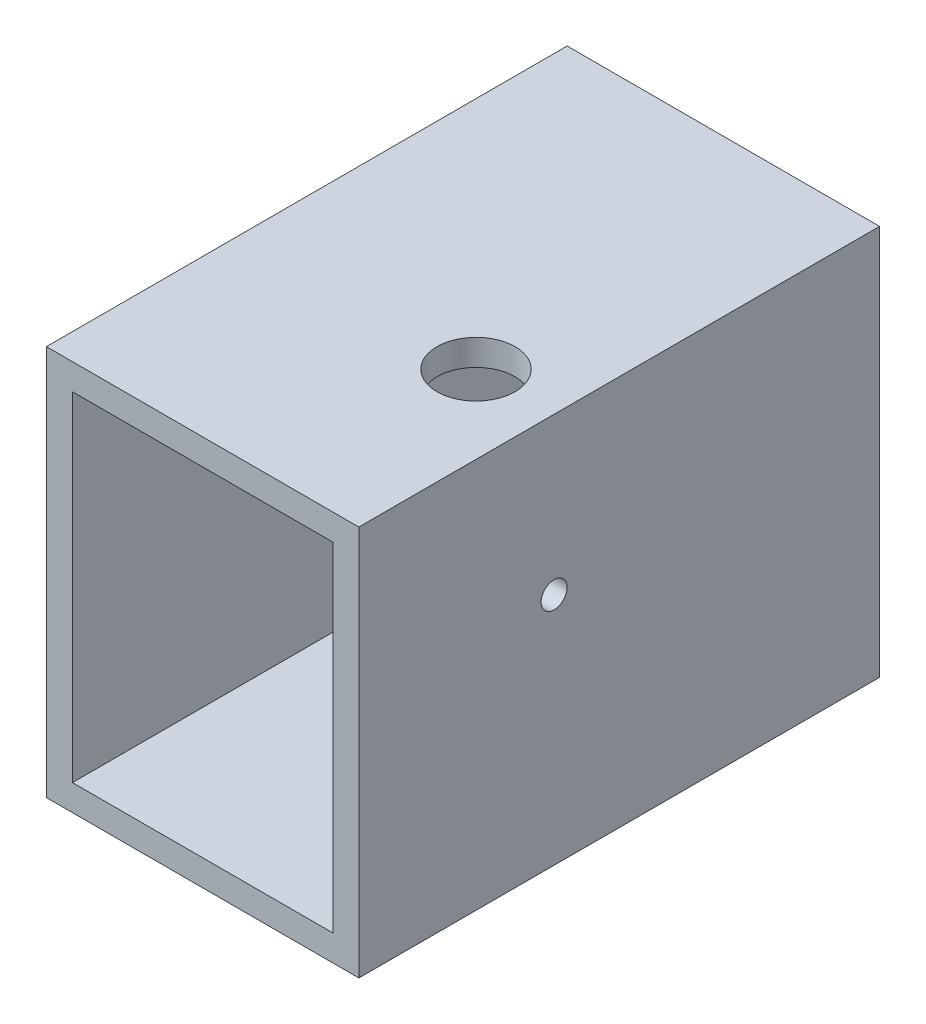
ISO-10303-21;
HEADER;
FILE_DESCRIPTION(('STEP AP214'),'2;1');
FILE_NAME('part.step','',(''),(''),'','','');
FILE_SCHEMA(('AUTOMOTIVE_DESIGN { 1 0 10303 214 1 1 1 1 }'));
ENDSEC;
DATA;
#1=APPLICATION_CONTEXT('core data for automotive mechanical design processes');
#2=APPLICATION_PROTOCOL_DEFINITION('international standard','automotive_design',2000,#1);
#3=PRODUCT_CONTEXT('',#1,'mechanical');
#4=PRODUCT('Part','Part','',(#3));
#5=PRODUCT_RELATED_PRODUCT_CATEGORY('part','',(#4));
#6=PRODUCT_DEFINITION_FORMATION('','',#4);
#7=PRODUCT_DEFINITION_CONTEXT('part definition',#1,'design');
#8=PRODUCT_DEFINITION('design','',#6,#7);
#9=PRODUCT_DEFINITION_SHAPE('','',#8);
#10=(LENGTH_UNIT() NAMED_UNIT(*) SI_UNIT(.MILLI.,.METRE.));
#11=(NAMED_UNIT(*) PLANE_ANGLE_UNIT() SI_UNIT($,.RADIAN.));
#12=(NAMED_UNIT(*) SI_UNIT($,.STERADIAN.) SOLID_ANGLE_UNIT());
#13=UNCERTAINTY_MEASURE_WITH_UNIT(LENGTH_MEASURE(1.E-05),#10,'distance_accuracy_value','');
#14=(GEOMETRIC_REPRESENTATION_CONTEXT(3) GLOBAL_UNCERTAINTY_ASSIGNED_CONTEXT((#13)) GLOBAL_UNIT_ASSIGNED_CONTEXT((#10,
#11,#12)) REPRESENTATION_CONTEXT('',''));
#15=CARTESIAN_POINT('',(0.,0.,0.));
#16=DIRECTION('',(0.,0.,1.));
#17=DIRECTION('',(1.,0.,0.));
#18=AXIS2_PLACEMENT_3D('',#15,#16,#17);
#19=CARTESIAN_POINT('',(0.,0.,200.));
#20=DIRECTION('',(1.,0.,0.));
#21=DIRECTION('',(0.,1.,0.));
#22=AXIS2_PLACEMENT_3D('',#19,#20,#21);
#23=PLANE('',#22);
#24=CARTESIAN_POINT('',(0.,-60.,125.));
#25=DIRECTION('',(1.,0.,0.));
#26=DIRECTION('',(0.,1.,0.));
#27=AXIS2_PLACEMENT_3D('',#24,#25,#26);
#28=CIRCLE('',#27,5.00000000000001);
#29=CARTESIAN_POINT('',(0.,-55.,125.));
#30=VERTEX_POINT('',#29);
#31=EDGE_CURVE('E172',#30,#30,#28,.T.);
#32=ORIENTED_EDGE('',*,*,#31,.T.);
#33=EDGE_LOOP('',(#32));
#34=FACE_BOUND('',#33,.T.);
#35=DIRECTION('',(0.,-1.,0.));
#36=VECTOR('',#35,1.);
#37=CARTESIAN_POINT('',(0.,0.,0.));
#38=LINE('',#37,#36);
#39=CARTESIAN_POINT('',(0.,0.,0.));
#40=VERTEX_POINT('',#39);
#41=CARTESIAN_POINT('',(0.,-150.,0.));
#42=VERTEX_POINT('',#41);
#43=EDGE_CURVE('E148',#40,#42,#38,.T.);
#44=ORIENTED_EDGE('',*,*,#43,.T.);
#45=DIRECTION('',(0.,0.,-1.));
#46=VECTOR('',#45,1.);
#47=CARTESIAN_POINT('',(0.,-150.,200.));
#48=LINE('',#47,#46);
#49=CARTESIAN_POINT('',(0.,-150.,200.));
#50=VERTEX_POINT('',#49);
#51=EDGE_CURVE('E11',#50,#42,#48,.T.);
#52=ORIENTED_EDGE('',*,*,#51,.F.);
#53=DIRECTION('',(0.,-1.,0.));
#54=VECTOR('',#53,1.);
#55=CARTESIAN_POINT('',(0.,0.,200.));
#56=LINE('',#55,#54);
#57=CARTESIAN_POINT('',(0.,0.,200.));
#58=VERTEX_POINT('',#57);
#59=EDGE_CURVE('E152',#58,#50,#56,.T.);
#60=ORIENTED_EDGE('',*,*,#59,.F.);
#61=DIRECTION('',(0.,0.,-1.));
#62=VECTOR('',#61,1.);
#63=CARTESIAN_POINT('',(0.,0.,200.));
#64=LINE('',#63,#62);
#65=EDGE_CURVE('E158',#58,#40,#64,.T.);
#66=ORIENTED_EDGE('',*,*,#65,.T.);
#67=EDGE_LOOP('',(#44,#52,#60,#66));
#68=FACE_BOUND('',#67,.T.);
#69=ADVANCED_FACE('F35',(#34,#68),#23,.F.);
#70=CARTESIAN_POINT('',(0.,-150.,200.));
#71=DIRECTION('',(0.,1.,0.));
#72=DIRECTION('',(0.,0.,1.));
#73=AXIS2_PLACEMENT_3D('',#70,#71,#72);
#74=PLANE('',#73);
#75=DIRECTION('',(1.,0.,0.));
#76=VECTOR('',#75,1.);
#77=CARTESIAN_POINT('',(0.,-150.,0.));
#78=LINE('',#77,#76);
#79=CARTESIAN_POINT('',(120.,-150.,0.));
#80=VERTEX_POINT('',#79);
#81=EDGE_CURVE('E161',#42,#80,#78,.T.);
#82=ORIENTED_EDGE('',*,*,#81,.T.);
#83=DIRECTION('',(0.,0.,-1.));
#84=VECTOR('',#83,1.);
#85=CARTESIAN_POINT('',(120.,-150.,200.));
#86=LINE('',#85,#84);
#87=CARTESIAN_POINT('',(120.,-150.,200.));
#88=VERTEX_POINT('',#87);
#89=EDGE_CURVE('E43',#88,#80,#86,.T.);
#90=ORIENTED_EDGE('',*,*,#89,.F.);
#91=DIRECTION('',(1.,0.,0.));
#92=VECTOR('',#91,1.);
#93=CARTESIAN_POINT('',(0.,-150.,200.));
#94=LINE('',#93,#92);
#95=EDGE_CURVE('E88',#50,#88,#94,.T.);
#96=ORIENTED_EDGE('',*,*,#95,.F.);
#97=ORIENTED_EDGE('',*,*,#51,.T.);
#98=EDGE_LOOP('',(#82,#90,#96,#97));
#99=FACE_BOUND('',#98,.T.);
#100=ADVANCED_FACE('F203',(#99),#74,.F.);
#101=CARTESIAN_POINT('',(120.,0.,200.));
#102=DIRECTION('',(-1.,0.,0.));
#103=DIRECTION('',(0.,-1.,0.));
#104=AXIS2_PLACEMENT_3D('',#101,#102,#103);
#105=PLANE('',#104);
#106=CARTESIAN_POINT('',(120.,-60.,125.));
#107=DIRECTION('',(1.,0.,0.));
#108=DIRECTION('',(0.,1.,0.));
#109=AXIS2_PLACEMENT_3D('',#106,#107,#108);
#110=CIRCLE('',#109,5.00000000000001);
#111=CARTESIAN_POINT('',(120.,-55.,125.));
#112=VERTEX_POINT('',#111);
#113=EDGE_CURVE('E177',#112,#112,#110,.T.);
#114=ORIENTED_EDGE('',*,*,#113,.F.);
#115=EDGE_LOOP('',(#114));
#116=FACE_BOUND('',#115,.T.);
#117=DIRECTION('',(0.,1.,0.));
#118=VECTOR('',#117,1.);
#119=CARTESIAN_POINT('',(120.,0.,0.));
#120=LINE('',#119,#118);
#121=CARTESIAN_POINT('',(120.,0.,0.));
#122=VERTEX_POINT('',#121);
#123=EDGE_CURVE('E163',#80,#122,#120,.T.);
#124=ORIENTED_EDGE('',*,*,#123,.T.);
#125=DIRECTION('',(0.,0.,-1.));
#126=VECTOR('',#125,1.);
#127=CARTESIAN_POINT('',(120.,0.,200.));
#128=LINE('',#127,#126);
#129=CARTESIAN_POINT('',(120.,0.,200.));
#130=VERTEX_POINT('',#129);
#131=EDGE_CURVE('E167',#130,#122,#128,.T.);
#132=ORIENTED_EDGE('',*,*,#131,.F.);
#133=DIRECTION('',(0.,1.,0.));
#134=VECTOR('',#133,1.);
#135=CARTESIAN_POINT('',(120.,0.,200.));
#136=LINE('',#135,#134);
#137=EDGE_CURVE('E155',#88,#130,#136,.T.);
#138=ORIENTED_EDGE('',*,*,#137,.F.);
#139=ORIENTED_EDGE('',*,*,#89,.T.);
#140=EDGE_LOOP('',(#124,#132,#138,#139));
#141=FACE_BOUND('',#140,.T.);
#142=ADVANCED_FACE('F207',(#116,#141),#105,.F.);
#143=CARTESIAN_POINT('',(0.,0.,200.));
#144=DIRECTION('',(0.,-1.,0.));
#145=DIRECTION('',(0.,0.,-1.));
#146=AXIS2_PLACEMENT_3D('',#143,#144,#145);
#147=PLANE('',#146);
#148=CARTESIAN_POINT('',(90.0000000000001,0.,125.));
#149=DIRECTION('',(0.,-1.,0.));
#150=DIRECTION('',(0.,0.,-1.));
#151=AXIS2_PLACEMENT_3D('',#148,#149,#150);
#152=CIRCLE('',#151,15.);
#153=CARTESIAN_POINT('',(90.0000000000001,0.,110.));
#154=VERTEX_POINT('',#153);
#155=EDGE_CURVE('E182',#154,#154,#152,.T.);
#156=ORIENTED_EDGE('',*,*,#155,.T.);
#157=EDGE_LOOP('',(#156));
#158=FACE_BOUND('',#157,.T.);
#159=DIRECTION('',(-1.,0.,0.));
#160=VECTOR('',#159,1.);
#161=CARTESIAN_POINT('',(0.,0.,0.));
#162=LINE('',#161,#160);
#163=EDGE_CURVE('E81',#122,#40,#162,.T.);
#164=ORIENTED_EDGE('',*,*,#163,.T.);
#165=ORIENTED_EDGE('',*,*,#65,.F.);
#166=DIRECTION('',(-1.,0.,0.));
#167=VECTOR('',#166,1.);
#168=CARTESIAN_POINT('',(0.,0.,200.));
#169=LINE('',#168,#167);
#170=EDGE_CURVE('E60',#130,#58,#169,.T.);
#171=ORIENTED_EDGE('',*,*,#170,.F.);
#172=ORIENTED_EDGE('',*,*,#131,.T.);
#173=EDGE_LOOP('',(#164,#165,#171,#172));
#174=FACE_BOUND('',#173,.T.);
#175=ADVANCED_FACE('F220',(#158,#174),#147,.F.);
#176=CARTESIAN_POINT('',(0.,0.,200.));
#177=DIRECTION('',(0.,0.,1.));
#178=DIRECTION('',(1.,0.,0.));
#179=AXIS2_PLACEMENT_3D('',#176,#177,#178);
#180=PLANE('',#179);
#181=DIRECTION('',(-1.,0.,0.));
#182=VECTOR('',#181,1.);
#183=CARTESIAN_POINT('',(10.,-10.,200.));
#184=LINE('',#183,#182);
#185=CARTESIAN_POINT('',(110.,-10.,200.));
#186=VERTEX_POINT('',#185);
#187=CARTESIAN_POINT('',(10.,-10.,200.));
#188=VERTEX_POINT('',#187);
#189=EDGE_CURVE('E51',#186,#188,#184,.T.);
#190=ORIENTED_EDGE('',*,*,#189,.F.);
#191=DIRECTION('',(0.,1.,0.));
#192=VECTOR('',#191,1.);
#193=CARTESIAN_POINT('',(110.,-10.,200.));
#194=LINE('',#193,#192);
#195=CARTESIAN_POINT('',(110.,-140.,200.));
#196=VERTEX_POINT('',#195);
#197=EDGE_CURVE('E130',#196,#186,#194,.T.);
#198=ORIENTED_EDGE('',*,*,#197,.F.);
#199=DIRECTION('',(1.,0.,0.));
#200=VECTOR('',#199,1.);
#201=CARTESIAN_POINT('',(10.,-140.,200.));
#202=LINE('',#201,#200);
#203=CARTESIAN_POINT('',(10.,-140.,200.));
#204=VERTEX_POINT('',#203);
#205=EDGE_CURVE('E133',#204,#196,#202,.T.);
#206=ORIENTED_EDGE('',*,*,#205,.F.);
#207=DIRECTION('',(0.,-1.,0.));
#208=VECTOR('',#207,1.);
#209=CARTESIAN_POINT('',(10.,-10.,200.));
#210=LINE('',#209,#208);
#211=EDGE_CURVE('E142',#188,#204,#210,.T.);
#212=ORIENTED_EDGE('',*,*,#211,.F.);
#213=EDGE_LOOP('',(#190,#198,#206,#212));
#214=FACE_BOUND('',#213,.T.);
#215=ORIENTED_EDGE('',*,*,#59,.T.);
#216=ORIENTED_EDGE('',*,*,#95,.T.);
#217=ORIENTED_EDGE('',*,*,#137,.T.);
#218=ORIENTED_EDGE('',*,*,#170,.T.);
#219=EDGE_LOOP('',(#215,#216,#217,#218));
#220=FACE_BOUND('',#219,.T.);
#221=ADVANCED_FACE('F218',(#214,#220),#180,.T.);
#222=CARTESIAN_POINT('',(0.,0.,0.));
#223=DIRECTION('',(0.,0.,1.));
#224=DIRECTION('',(1.,0.,0.));
#225=AXIS2_PLACEMENT_3D('',#222,#223,#224);
#226=PLANE('',#225);
#227=ORIENTED_EDGE('',*,*,#43,.F.);
#228=ORIENTED_EDGE('',*,*,#163,.F.);
#229=ORIENTED_EDGE('',*,*,#123,.F.);
#230=ORIENTED_EDGE('',*,*,#81,.F.);
#231=EDGE_LOOP('',(#227,#228,#229,#230));
#232=FACE_BOUND('',#231,.T.);
#233=ADVANCED_FACE('F213',(#232),#226,.F.);
#234=CARTESIAN_POINT('',(10.,-10.,5.));
#235=DIRECTION('',(0.,1.,0.));
#236=DIRECTION('',(0.,0.,1.));
#237=AXIS2_PLACEMENT_3D('',#234,#235,#236);
#238=PLANE('',#237);
#239=CARTESIAN_POINT('',(90.0000000000001,-10.,125.));
#240=DIRECTION('',(0.,1.,0.));
#241=DIRECTION('',(0.,0.,1.));
#242=AXIS2_PLACEMENT_3D('',#239,#240,#241);
#243=CIRCLE('',#242,15.);
#244=CARTESIAN_POINT('',(90.0000000000001,-10.,110.));
#245=VERTEX_POINT('',#244);
#246=EDGE_CURVE('E38',#245,#245,#243,.T.);
#247=ORIENTED_EDGE('',*,*,#246,.T.);
#248=EDGE_LOOP('',(#247));
#249=FACE_BOUND('',#248,.T.);
#250=ORIENTED_EDGE('',*,*,#189,.T.);
#251=DIRECTION('',(0.,0.,1.));
#252=VECTOR('',#251,1.);
#253=CARTESIAN_POINT('',(10.,-10.,5.));
#254=LINE('',#253,#252);
#255=CARTESIAN_POINT('',(10.,-10.,5.));
#256=VERTEX_POINT('',#255);
#257=EDGE_CURVE('E108',#256,#188,#254,.T.);
#258=ORIENTED_EDGE('',*,*,#257,.F.);
#259=DIRECTION('',(-1.,0.,0.));
#260=VECTOR('',#259,1.);
#261=CARTESIAN_POINT('',(10.,-10.,5.));
#262=LINE('',#261,#260);
#263=CARTESIAN_POINT('',(110.,-10.,5.));
#264=VERTEX_POINT('',#263);
#265=EDGE_CURVE('E112',#264,#256,#262,.T.);
#266=ORIENTED_EDGE('',*,*,#265,.F.);
#267=DIRECTION('',(0.,0.,1.));
#268=VECTOR('',#267,1.);
#269=CARTESIAN_POINT('',(110.,-10.,5.));
#270=LINE('',#269,#268);
#271=EDGE_CURVE('E146',#264,#186,#270,.T.);
#272=ORIENTED_EDGE('',*,*,#271,.T.);
#273=EDGE_LOOP('',(#250,#258,#266,#272));
#274=FACE_BOUND('',#273,.T.);
#275=ADVANCED_FACE('F110',(#249,#274),#238,.F.);
#276=CARTESIAN_POINT('',(110.,-10.,5.));
#277=DIRECTION('',(1.,0.,0.));
#278=DIRECTION('',(0.,0.,-1.));
#279=AXIS2_PLACEMENT_3D('',#276,#277,#278);
#280=PLANE('',#279);
#281=CARTESIAN_POINT('',(110.,-60.,125.));
#282=DIRECTION('',(1.,0.,0.));
#283=DIRECTION('',(0.,0.,-1.));
#284=AXIS2_PLACEMENT_3D('',#281,#282,#283);
#285=CIRCLE('',#284,5.00000000000001);
#286=CARTESIAN_POINT('',(110.,-60.,120.));
#287=VERTEX_POINT('',#286);
#288=EDGE_CURVE('E136',#287,#287,#285,.T.);
#289=ORIENTED_EDGE('',*,*,#288,.T.);
#290=EDGE_LOOP('',(#289));
#291=FACE_BOUND('',#290,.T.);
#292=ORIENTED_EDGE('',*,*,#197,.T.);
#293=ORIENTED_EDGE('',*,*,#271,.F.);
#294=DIRECTION('',(0.,1.,0.));
#295=VECTOR('',#294,1.);
#296=CARTESIAN_POINT('',(110.,-10.,5.));
#297=LINE('',#296,#295);
#298=CARTESIAN_POINT('',(110.,-140.,5.));
#299=VERTEX_POINT('',#298);
#300=EDGE_CURVE('E118',#299,#264,#297,.T.);
#301=ORIENTED_EDGE('',*,*,#300,.F.);
#302=DIRECTION('',(0.,0.,1.));
#303=VECTOR('',#302,1.);
#304=CARTESIAN_POINT('',(110.,-140.,5.));
#305=LINE('',#304,#303);
#306=EDGE_CURVE('E149',#299,#196,#305,.T.);
#307=ORIENTED_EDGE('',*,*,#306,.T.);
#308=EDGE_LOOP('',(#292,#293,#301,#307));
#309=FACE_BOUND('',#308,.T.);
#310=ADVANCED_FACE('F241',(#291,#309),#280,.F.);
#311=CARTESIAN_POINT('',(10.,-140.,5.));
#312=DIRECTION('',(0.,-1.,0.));
#313=DIRECTION('',(0.,0.,-1.));
#314=AXIS2_PLACEMENT_3D('',#311,#312,#313);
#315=PLANE('',#314);
#316=ORIENTED_EDGE('',*,*,#205,.T.);
#317=ORIENTED_EDGE('',*,*,#306,.F.);
#318=DIRECTION('',(1.,0.,0.));
#319=VECTOR('',#318,1.);
#320=CARTESIAN_POINT('',(10.,-140.,5.));
#321=LINE('',#320,#319);
#322=CARTESIAN_POINT('',(10.,-140.,5.));
#323=VERTEX_POINT('',#322);
#324=EDGE_CURVE('E126',#323,#299,#321,.T.);
#325=ORIENTED_EDGE('',*,*,#324,.F.);
#326=DIRECTION('',(0.,0.,1.));
#327=VECTOR('',#326,1.);
#328=CARTESIAN_POINT('',(10.,-140.,5.));
#329=LINE('',#328,#327);
#330=EDGE_CURVE('E117',#323,#204,#329,.T.);
#331=ORIENTED_EDGE('',*,*,#330,.T.);
#332=EDGE_LOOP('',(#316,#317,#325,#331));
#333=FACE_BOUND('',#332,.T.);
#334=ADVANCED_FACE('F244',(#333),#315,.F.);
#335=CARTESIAN_POINT('',(10.,-10.,5.));
#336=DIRECTION('',(-1.,0.,0.));
#337=DIRECTION('',(0.,0.,1.));
#338=AXIS2_PLACEMENT_3D('',#335,#336,#337);
#339=PLANE('',#338);
#340=CARTESIAN_POINT('',(10.,-60.,125.));
#341=DIRECTION('',(-1.,0.,0.));
#342=DIRECTION('',(0.,0.,1.));
#343=AXIS2_PLACEMENT_3D('',#340,#341,#342);
#344=CIRCLE('',#343,5.00000000000001);
#345=CARTESIAN_POINT('',(10.,-60.,130.));
#346=VERTEX_POINT('',#345);
#347=EDGE_CURVE('E170',#346,#346,#344,.T.);
#348=ORIENTED_EDGE('',*,*,#347,.T.);
#349=EDGE_LOOP('',(#348));
#350=FACE_BOUND('',#349,.T.);
#351=ORIENTED_EDGE('',*,*,#211,.T.);
#352=ORIENTED_EDGE('',*,*,#330,.F.);
#353=DIRECTION('',(0.,-1.,0.));
#354=VECTOR('',#353,1.);
#355=CARTESIAN_POINT('',(10.,-10.,5.));
#356=LINE('',#355,#354);
#357=EDGE_CURVE('E121',#256,#323,#356,.T.);
#358=ORIENTED_EDGE('',*,*,#357,.F.);
#359=ORIENTED_EDGE('',*,*,#257,.T.);
#360=EDGE_LOOP('',(#351,#352,#358,#359));
#361=FACE_BOUND('',#360,.T.);
#362=ADVANCED_FACE('F122',(#350,#361),#339,.F.);
#363=CARTESIAN_POINT('',(0.,0.,5.));
#364=DIRECTION('',(0.,0.,-1.));
#365=DIRECTION('',(-1.,0.,0.));
#366=AXIS2_PLACEMENT_3D('',#363,#364,#365);
#367=PLANE('',#366);
#368=ORIENTED_EDGE('',*,*,#265,.T.);
#369=ORIENTED_EDGE('',*,*,#357,.T.);
#370=ORIENTED_EDGE('',*,*,#324,.T.);
#371=ORIENTED_EDGE('',*,*,#300,.T.);
#372=EDGE_LOOP('',(#368,#369,#370,#371));
#373=FACE_BOUND('',#372,.T.);
#374=ADVANCED_FACE('F128',(#373),#367,.F.);
#375=CARTESIAN_POINT('',(0.,-60.,125.));
#376=DIRECTION('',(1.,0.,0.));
#377=DIRECTION('',(0.,1.,0.));
#378=AXIS2_PLACEMENT_3D('',#375,#376,#377);
#379=CYLINDRICAL_SURFACE('',#378,5.00000000000001);
#380=ORIENTED_EDGE('',*,*,#31,.F.);
#381=EDGE_LOOP('',(#380));
#382=FACE_BOUND('',#381,.T.);
#383=ORIENTED_EDGE('',*,*,#347,.F.);
#384=EDGE_LOOP('',(#383));
#385=FACE_BOUND('',#384,.T.);
#386=ADVANCED_FACE('F199',(#382,#385),#379,.F.);
#387=ORIENTED_EDGE('',*,*,#113,.T.);
#388=EDGE_LOOP('',(#387));
#389=FACE_BOUND('',#388,.T.);
#390=ORIENTED_EDGE('',*,*,#288,.F.);
#391=EDGE_LOOP('',(#390));
#392=FACE_BOUND('',#391,.T.);
#393=ADVANCED_FACE('F194',(#389,#392),#379,.F.);
#394=CARTESIAN_POINT('',(90.0000000000001,4.00000000000001,125.));
#395=DIRECTION('',(0.,-1.,0.));
#396=DIRECTION('',(0.,0.,-1.));
#397=AXIS2_PLACEMENT_3D('',#394,#395,#396);
#398=CYLINDRICAL_SURFACE('',#397,15.);
#399=CARTESIAN_POINT('',(90.0000000000001,-10.,110.));
#400=CARTESIAN_POINT('',(90.0000000000001,-9.89583333333333,110.));
#401=CARTESIAN_POINT('',(90.0000000000001,-9.79166666666667,110.));
#402=CARTESIAN_POINT('',(90.0000000000001,-9.58333333333333,110.));
#403=CARTESIAN_POINT('',(90.0000000000001,-9.47916666666667,110.));
#404=CARTESIAN_POINT('',(90.0000000000001,-9.27083333333333,110.));
#405=CARTESIAN_POINT('',(90.0000000000001,-9.16666666666667,110.));
#406=CARTESIAN_POINT('',(90.0000000000001,-8.95833333333333,110.));
#407=CARTESIAN_POINT('',(90.0000000000001,-8.85416666666667,110.));
#408=CARTESIAN_POINT('',(90.0000000000001,-8.64583333333333,110.));
#409=CARTESIAN_POINT('',(90.0000000000001,-8.54166666666667,110.));
#410=CARTESIAN_POINT('',(90.0000000000001,-8.33333333333333,110.));
#411=CARTESIAN_POINT('',(90.0000000000001,-8.22916666666667,110.));
#412=CARTESIAN_POINT('',(90.0000000000001,-8.02083333333333,110.));
#413=CARTESIAN_POINT('',(90.0000000000001,-7.91666666666667,110.));
#414=CARTESIAN_POINT('',(90.0000000000001,-7.70833333333333,110.));
#415=CARTESIAN_POINT('',(90.0000000000001,-7.60416666666667,110.));
#416=CARTESIAN_POINT('',(90.0000000000001,-7.39583333333333,110.));
#417=CARTESIAN_POINT('',(90.0000000000001,-7.29166666666667,110.));
#418=CARTESIAN_POINT('',(90.0000000000001,-7.08333333333333,110.));
#419=CARTESIAN_POINT('',(90.0000000000001,-6.97916666666667,110.));
#420=CARTESIAN_POINT('',(90.0000000000001,-6.77083333333333,110.));
#421=CARTESIAN_POINT('',(90.0000000000001,-6.66666666666667,110.));
#422=CARTESIAN_POINT('',(90.0000000000001,-6.45833333333333,110.));
#423=CARTESIAN_POINT('',(90.0000000000001,-6.35416666666667,110.));
#424=CARTESIAN_POINT('',(90.0000000000001,-6.14583333333333,110.));
#425=CARTESIAN_POINT('',(90.0000000000001,-6.04166666666667,110.));
#426=CARTESIAN_POINT('',(90.0000000000001,-5.83333333333333,110.));
#427=CARTESIAN_POINT('',(90.0000000000001,-5.72916666666667,110.));
#428=CARTESIAN_POINT('',(90.0000000000001,-5.52083333333333,110.));
#429=CARTESIAN_POINT('',(90.0000000000001,-5.41666666666667,110.));
#430=CARTESIAN_POINT('',(90.0000000000001,-5.20833333333333,110.));
#431=CARTESIAN_POINT('',(90.0000000000001,-5.10416666666667,110.));
#432=CARTESIAN_POINT('',(90.0000000000001,-4.89583333333333,110.));
#433=CARTESIAN_POINT('',(90.0000000000001,-4.79166666666667,110.));
#434=CARTESIAN_POINT('',(90.0000000000001,-4.58333333333333,110.));
#435=CARTESIAN_POINT('',(90.0000000000001,-4.47916666666667,110.));
#436=CARTESIAN_POINT('',(90.0000000000001,-4.27083333333333,110.));
#437=CARTESIAN_POINT('',(90.0000000000001,-4.16666666666667,110.));
#438=CARTESIAN_POINT('',(90.0000000000001,-3.95833333333333,110.));
#439=CARTESIAN_POINT('',(90.0000000000001,-3.85416666666667,110.));
#440=CARTESIAN_POINT('',(90.0000000000001,-3.64583333333333,110.));
#441=CARTESIAN_POINT('',(90.0000000000001,-3.54166666666667,110.));
#442=CARTESIAN_POINT('',(90.0000000000001,-3.33333333333333,110.));
#443=CARTESIAN_POINT('',(90.0000000000001,-3.22916666666667,110.));
#444=CARTESIAN_POINT('',(90.0000000000001,-3.02083333333333,110.));
#445=CARTESIAN_POINT('',(90.0000000000001,-2.91666666666667,110.));
#446=CARTESIAN_POINT('',(90.0000000000001,-2.70833333333333,110.));
#447=CARTESIAN_POINT('',(90.0000000000001,-2.60416666666667,110.));
#448=CARTESIAN_POINT('',(90.0000000000001,-2.39583333333333,110.));
#449=CARTESIAN_POINT('',(90.0000000000001,-2.29166666666667,110.));
#450=CARTESIAN_POINT('',(90.0000000000001,-2.08333333333333,110.));
#451=CARTESIAN_POINT('',(90.0000000000001,-1.97916666666667,110.));
#452=CARTESIAN_POINT('',(90.0000000000001,-1.77083333333333,110.));
#453=CARTESIAN_POINT('',(90.0000000000001,-1.66666666666667,110.));
#454=CARTESIAN_POINT('',(90.0000000000001,-1.45833333333333,110.));
#455=CARTESIAN_POINT('',(90.0000000000001,-1.35416666666667,110.));
#456=CARTESIAN_POINT('',(90.0000000000001,-1.14583333333333,110.));
#457=CARTESIAN_POINT('',(90.0000000000001,-1.04166666666667,110.));
#458=CARTESIAN_POINT('',(90.0000000000001,-0.833333333333333,110.));
#459=CARTESIAN_POINT('',(90.0000000000001,-0.729166666666667,110.));
#460=CARTESIAN_POINT('',(90.0000000000001,-0.520833333333333,110.));
#461=CARTESIAN_POINT('',(90.0000000000001,-0.416666666666666,110.));
#462=CARTESIAN_POINT('',(90.0000000000001,-0.208333333333333,110.));
#463=CARTESIAN_POINT('',(90.0000000000001,-0.104166666666666,110.));
#464=CARTESIAN_POINT('',(90.0000000000001,0.,110.));
#465=B_SPLINE_CURVE_WITH_KNOTS('',3,(#399,#400,#401,#402,#403,#404,#405,#406,#407,#408,#409,
#410,#411,#412,#413,#414,#415,#416,#417,#418,#419,#420,#421,#422,#423,#424,#425,#426,#427,#428,
#429,#430,#431,#432,#433,#434,#435,#436,#437,#438,#439,#440,#441,#442,#443,#444,#445,#446,#447,
#448,#449,#450,#451,#452,#453,#454,#455,#456,#457,#458,#459,#460,#461,#462,#463,#464),
.UNSPECIFIED.,.F.,.F.,(4,2,2,2,2,2,2,2,2,2,2,2,2,2,2,2,2,2,2,2,2,2,2,2,2,2,2,2,2,2,2,2,4),(0.,
0.3125,0.625000000000001,0.937500000000001,1.25,1.5625,1.875,2.1875,2.5,2.8125,3.125,3.4375,
3.75,4.0625,4.375,4.6875,5.,5.3125,5.625,5.9375,6.25,6.5625,6.875,7.1875,7.5,7.8125,8.125,
8.4375,8.75,9.0625,9.375,9.6875,10.),.UNSPECIFIED.);
#466=EDGE_CURVE('BSEAM191',#245,#154,#465,.T.);
#467=ORIENTED_EDGE('',*,*,#246,.F.);
#468=ORIENTED_EDGE('',*,*,#155,.F.);
#469=ORIENTED_EDGE('',*,*,#466,.T.);
#470=ORIENTED_EDGE('',*,*,#466,.F.);
#471=EDGE_LOOP('',(#467,#469,#468,#470));
#472=FACE_BOUND('',#471,.T.);
#473=ADVANCED_FACE('F191',(#472),#398,.F.);
#474=CLOSED_SHELL('',(#69,#100,#142,#175,#221,#233,#275,#310,#334,#362,#374,#386,#393,#473));
#475=MANIFOLD_SOLID_BREP('B2',#474);
#476=ADVANCED_BREP_SHAPE_REPRESENTATION('',(#18,#475),#14);
#477=SHAPE_DEFINITION_REPRESENTATION(#9,#476);
ENDSEC;
END-ISO-10303-21;
